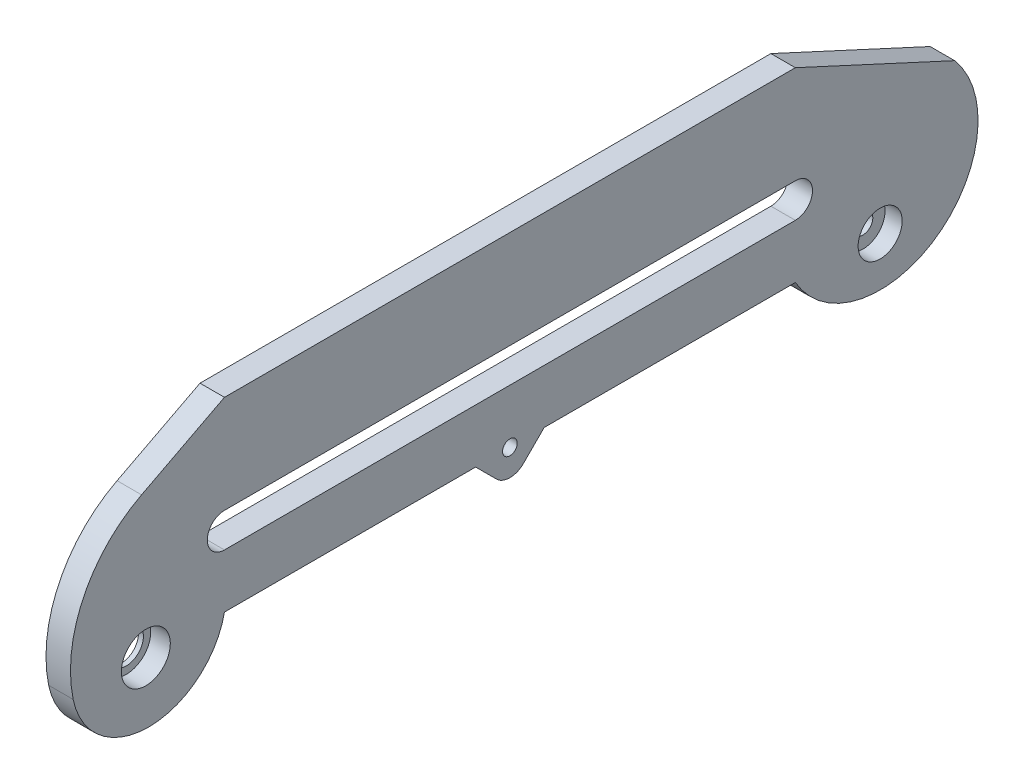
ISO-10303-21;
HEADER;
FILE_DESCRIPTION(('STEP AP214'),'2;1');
FILE_NAME('part.step','',(''),(''),'','','');
FILE_SCHEMA(('AUTOMOTIVE_DESIGN { 1 0 10303 214 1 1 1 1 }'));
ENDSEC;
DATA;
#1=APPLICATION_CONTEXT('core data for automotive mechanical design processes');
#2=APPLICATION_PROTOCOL_DEFINITION('international standard','automotive_design',2000,#1);
#3=PRODUCT_CONTEXT('',#1,'mechanical');
#4=PRODUCT('Part','Part','',(#3));
#5=PRODUCT_RELATED_PRODUCT_CATEGORY('part','',(#4));
#6=PRODUCT_DEFINITION_FORMATION('','',#4);
#7=PRODUCT_DEFINITION_CONTEXT('part definition',#1,'design');
#8=PRODUCT_DEFINITION('design','',#6,#7);
#9=PRODUCT_DEFINITION_SHAPE('','',#8);
#10=(LENGTH_UNIT() NAMED_UNIT(*) SI_UNIT(.MILLI.,.METRE.));
#11=(NAMED_UNIT(*) PLANE_ANGLE_UNIT() SI_UNIT($,.RADIAN.));
#12=(NAMED_UNIT(*) SI_UNIT($,.STERADIAN.) SOLID_ANGLE_UNIT());
#13=UNCERTAINTY_MEASURE_WITH_UNIT(LENGTH_MEASURE(1.E-05),#10,'distance_accuracy_value','');
#14=(GEOMETRIC_REPRESENTATION_CONTEXT(3) GLOBAL_UNCERTAINTY_ASSIGNED_CONTEXT((#13)) GLOBAL_UNIT_ASSIGNED_CONTEXT((#10,
#11,#12)) REPRESENTATION_CONTEXT('',''));
#15=CARTESIAN_POINT('',(0.,0.,0.));
#16=DIRECTION('',(0.,0.,1.));
#17=DIRECTION('',(1.,0.,0.));
#18=AXIS2_PLACEMENT_3D('',#15,#16,#17);
#19=CARTESIAN_POINT('',(5.,-37.996128985248,-75.6291845871765));
#20=DIRECTION('',(-1.,0.,0.));
#21=DIRECTION('',(0.,0.,1.));
#22=AXIS2_PLACEMENT_3D('',#19,#20,#21);
#23=CYLINDRICAL_SURFACE('',#22,1.99999999999998);
#24=CARTESIAN_POINT('',(0.,-37.996128985248,-75.6291845871765));
#25=DIRECTION('',(1.,0.,0.));
#26=DIRECTION('',(0.,0.,-1.));
#27=AXIS2_PLACEMENT_3D('',#24,#25,#26);
#28=CIRCLE('',#27,1.99999999999998);
#29=CARTESIAN_POINT('',(0.,-37.996128985248,-77.6291845871765));
#30=VERTEX_POINT('',#29);
#31=EDGE_CURVE('E176',#30,#30,#28,.T.);
#32=ORIENTED_EDGE('',*,*,#31,.F.);
#33=EDGE_LOOP('',(#32));
#34=FACE_BOUND('',#33,.T.);
#35=CARTESIAN_POINT('',(1.5,-37.996128985248,-75.6291845871765));
#36=DIRECTION('',(1.,0.,0.));
#37=DIRECTION('',(0.,0.,-1.));
#38=AXIS2_PLACEMENT_3D('',#35,#36,#37);
#39=CIRCLE('',#38,1.99999999999998);
#40=CARTESIAN_POINT('',(1.5,-37.996128985248,-77.6291845871765));
#41=VERTEX_POINT('',#40);
#42=EDGE_CURVE('E262',#41,#41,#39,.T.);
#43=ORIENTED_EDGE('',*,*,#42,.T.);
#44=EDGE_LOOP('',(#43));
#45=FACE_BOUND('',#44,.T.);
#46=ADVANCED_FACE('F39',(#34,#45),#23,.F.);
#47=CARTESIAN_POINT('',(5.,-39.4814103594866,0.));
#48=DIRECTION('',(1.,0.,0.));
#49=DIRECTION('',(0.,0.,-1.));
#50=AXIS2_PLACEMENT_3D('',#47,#48,#49);
#51=PLANE('',#50);
#52=CARTESIAN_POINT('',(5.,-37.996128985248,-75.6291845871765));
#53=DIRECTION('',(1.,0.,0.));
#54=DIRECTION('',(0.,0.,-1.));
#55=AXIS2_PLACEMENT_3D('',#52,#53,#54);
#56=CIRCLE('',#55,4.50000000000001);
#57=CARTESIAN_POINT('',(5.,-37.996128985248,-80.1291845871765));
#58=VERTEX_POINT('',#57);
#59=EDGE_CURVE('E272',#58,#58,#56,.T.);
#60=ORIENTED_EDGE('',*,*,#59,.F.);
#61=EDGE_LOOP('',(#60));
#62=FACE_BOUND('',#61,.T.);
#63=CARTESIAN_POINT('',(5.,-37.996128985248,74.3708154128235));
#64=DIRECTION('',(1.,0.,0.));
#65=DIRECTION('',(0.,0.,-1.));
#66=AXIS2_PLACEMENT_3D('',#63,#64,#65);
#67=CIRCLE('',#66,5.00000000000001);
#68=CARTESIAN_POINT('',(5.,-37.996128985248,69.3708154128235));
#69=VERTEX_POINT('',#68);
#70=EDGE_CURVE('E284',#69,#69,#67,.T.);
#71=ORIENTED_EDGE('',*,*,#70,.F.);
#72=EDGE_LOOP('',(#71));
#73=FACE_BOUND('',#72,.T.);
#74=DIRECTION('',(0.,0.,1.));
#75=VECTOR('',#74,1.);
#76=CARTESIAN_POINT('',(5.,-20.,-58.3086765114883));
#77=LINE('',#76,#75);
#78=CARTESIAN_POINT('',(5.,-20.,-58.3086765114883));
#79=VERTEX_POINT('',#78);
#80=CARTESIAN_POINT('',(5.,-20.,58.3086765114883));
#81=VERTEX_POINT('',#80);
#82=EDGE_CURVE('E154',#79,#81,#77,.T.);
#83=ORIENTED_EDGE('',*,*,#82,.F.);
#84=CARTESIAN_POINT('',(5.,-23.5,-58.3086765114883));
#85=DIRECTION('',(1.,0.,0.));
#86=DIRECTION('',(0.,0.,-1.));
#87=AXIS2_PLACEMENT_3D('',#84,#85,#86);
#88=CIRCLE('',#87,3.5);
#89=CARTESIAN_POINT('',(5.,-27.,-58.3086765114883));
#90=VERTEX_POINT('',#89);
#91=EDGE_CURVE('E146',#90,#79,#88,.T.);
#92=ORIENTED_EDGE('',*,*,#91,.F.);
#93=DIRECTION('',(0.,0.,-1.));
#94=VECTOR('',#93,1.);
#95=CARTESIAN_POINT('',(5.,-27.,58.3086765114883));
#96=LINE('',#95,#94);
#97=CARTESIAN_POINT('',(5.,-27.,58.3086765114883));
#98=VERTEX_POINT('',#97);
#99=EDGE_CURVE('E170',#98,#90,#96,.T.);
#100=ORIENTED_EDGE('',*,*,#99,.F.);
#101=CARTESIAN_POINT('',(5.,-23.5,58.3086765114883));
#102=DIRECTION('',(1.,0.,0.));
#103=DIRECTION('',(0.,0.,-1.));
#104=AXIS2_PLACEMENT_3D('',#101,#102,#103);
#105=CIRCLE('',#104,3.5);
#106=EDGE_CURVE('E168',#81,#98,#105,.T.);
#107=ORIENTED_EDGE('',*,*,#106,.F.);
#108=EDGE_LOOP('',(#83,#92,#100,#107));
#109=FACE_BOUND('',#108,.T.);
#110=DIRECTION('',(0.,-0.707106781186547,-0.707106781186548));
#111=VECTOR('',#110,1.);
#112=CARTESIAN_POINT('',(5.,-37.996128985248,7.));
#113=LINE('',#112,#111);
#114=CARTESIAN_POINT('',(5.,-37.996128985248,7.));
#115=VERTEX_POINT('',#114);
#116=CARTESIAN_POINT('',(5.,-42.2387696723673,2.7573593128807));
#117=VERTEX_POINT('',#116);
#118=EDGE_CURVE('E186',#115,#117,#113,.T.);
#119=ORIENTED_EDGE('',*,*,#118,.T.);
#120=CARTESIAN_POINT('',(5.,-39.4814103594866,0.));
#121=DIRECTION('',(1.,0.,0.));
#122=DIRECTION('',(0.,0.,-1.));
#123=AXIS2_PLACEMENT_3D('',#120,#121,#122);
#124=CIRCLE('',#123,3.89949493661165);
#125=CARTESIAN_POINT('',(5.,-42.2387696723673,-2.75735931288071));
#126=VERTEX_POINT('',#125);
#127=EDGE_CURVE('E189',#117,#126,#124,.T.);
#128=ORIENTED_EDGE('',*,*,#127,.T.);
#129=DIRECTION('',(0.,0.707106781186547,-0.707106781186548));
#130=VECTOR('',#129,1.);
#131=CARTESIAN_POINT('',(5.,-42.2387696723673,-2.75735931288071));
#132=LINE('',#131,#130);
#133=CARTESIAN_POINT('',(5.,-37.996128985248,-7.));
#134=VERTEX_POINT('',#133);
#135=EDGE_CURVE('E192',#126,#134,#132,.T.);
#136=ORIENTED_EDGE('',*,*,#135,.T.);
#137=DIRECTION('',(0.,0.,-1.));
#138=VECTOR('',#137,1.);
#139=CARTESIAN_POINT('',(5.,-37.996128985248,-7.));
#140=LINE('',#139,#138);
#141=CARTESIAN_POINT('',(5.,-37.996128985248,-58.3086765114877));
#142=VERTEX_POINT('',#141);
#143=EDGE_CURVE('E194',#134,#142,#140,.T.);
#144=ORIENTED_EDGE('',*,*,#143,.T.);
#145=CARTESIAN_POINT('',(5.,-27.9961289852479,-75.6291845871765));
#146=DIRECTION('',(1.,0.,0.));
#147=DIRECTION('',(0.,0.,-1.));
#148=AXIS2_PLACEMENT_3D('',#145,#146,#147);
#149=CIRCLE('',#148,20.0000000000001);
#150=CARTESIAN_POINT('',(5.,-15.0234869323527,-90.8512264399457));
#151=VERTEX_POINT('',#150);
#152=EDGE_CURVE('E196',#142,#151,#149,.T.);
#153=ORIENTED_EDGE('',*,*,#152,.T.);
#154=DIRECTION('',(0.,0.41914669112093,0.907918526808643));
#155=VECTOR('',#154,1.);
#156=CARTESIAN_POINT('',(5.,-15.0234869323527,-90.8512264399457));
#157=LINE('',#156,#155);
#158=CARTESIAN_POINT('',(5.,0.,-58.3086765114883));
#159=VERTEX_POINT('',#158);
#160=EDGE_CURVE('E198',#151,#159,#157,.T.);
#161=ORIENTED_EDGE('',*,*,#160,.T.);
#162=DIRECTION('',(0.,0.,1.));
#163=VECTOR('',#162,1.);
#164=CARTESIAN_POINT('',(5.,0.,-58.3086765114883));
#165=LINE('',#164,#163);
#166=CARTESIAN_POINT('',(5.,0.,58.3086765114883));
#167=VERTEX_POINT('',#166);
#168=EDGE_CURVE('E200',#159,#167,#165,.T.);
#169=ORIENTED_EDGE('',*,*,#168,.T.);
#170=DIRECTION('',(0.,-0.460402833421338,0.887710105258245));
#171=VECTOR('',#170,1.);
#172=CARTESIAN_POINT('',(5.,0.,58.3086765114883));
#173=LINE('',#172,#171);
#174=CARTESIAN_POINT('',(5.,-8.78317906164381,75.2436652720342));
#175=VERTEX_POINT('',#174);
#176=EDGE_CURVE('E202',#167,#175,#173,.T.);
#177=ORIENTED_EDGE('',*,*,#176,.T.);
#178=CARTESIAN_POINT('',(5.,-32.6056842846763,62.9636397673244));
#179=DIRECTION('',(1.,0.,0.));
#180=DIRECTION('',(0.,0.,-1.));
#181=AXIS2_PLACEMENT_3D('',#178,#179,#180);
#182=CIRCLE('',#181,26.8013205177979);
#183=CARTESIAN_POINT('',(5.,-37.996128985248,89.217284989042));
#184=VERTEX_POINT('',#183);
#185=EDGE_CURVE('E204',#175,#184,#182,.T.);
#186=ORIENTED_EDGE('',*,*,#185,.T.);
#187=CARTESIAN_POINT('',(5.,-34.8230240056765,73.7629807502651));
#188=DIRECTION('',(1.,0.,0.));
#189=DIRECTION('',(0.,0.,-1.));
#190=AXIS2_PLACEMENT_3D('',#187,#188,#189);
#191=CIRCLE('',#190,15.7766953040254);
#192=CARTESIAN_POINT('',(5.,-37.9961289852481,58.3086765114883));
#193=VERTEX_POINT('',#192);
#194=EDGE_CURVE('E206',#184,#193,#191,.T.);
#195=ORIENTED_EDGE('',*,*,#194,.T.);
#196=DIRECTION('',(0.,0.,-1.));
#197=VECTOR('',#196,1.);
#198=CARTESIAN_POINT('',(5.,-37.9961289852481,58.3086765114883));
#199=LINE('',#198,#197);
#200=EDGE_CURVE('E208',#193,#115,#199,.T.);
#201=ORIENTED_EDGE('',*,*,#200,.T.);
#202=EDGE_LOOP('',(#119,#128,#136,#144,#153,#161,#169,#177,#186,#195,#201));
#203=FACE_BOUND('',#202,.T.);
#204=CARTESIAN_POINT('',(5.,-38.,0.));
#205=DIRECTION('',(1.,0.,0.));
#206=DIRECTION('',(0.,0.,-1.));
#207=AXIS2_PLACEMENT_3D('',#204,#205,#206);
#208=CIRCLE('',#207,1.5);
#209=CARTESIAN_POINT('',(5.,-38.,-1.5));
#210=VERTEX_POINT('',#209);
#211=EDGE_CURVE('E269',#210,#210,#208,.T.);
#212=ORIENTED_EDGE('',*,*,#211,.F.);
#213=EDGE_LOOP('',(#212));
#214=FACE_BOUND('',#213,.T.);
#215=ADVANCED_FACE('F166',(#62,#73,#109,#203,#214),#51,.T.);
#216=CARTESIAN_POINT('',(0.,-39.4814103594866,0.));
#217=DIRECTION('',(1.,0.,0.));
#218=DIRECTION('',(0.,0.,-1.));
#219=AXIS2_PLACEMENT_3D('',#216,#217,#218);
#220=PLANE('',#219);
#221=DIRECTION('',(0.,-0.707106781186547,-0.707106781186548));
#222=VECTOR('',#221,1.);
#223=CARTESIAN_POINT('',(0.,-37.996128985248,7.));
#224=LINE('',#223,#222);
#225=CARTESIAN_POINT('',(0.,-37.996128985248,7.));
#226=VERTEX_POINT('',#225);
#227=CARTESIAN_POINT('',(0.,-42.2387696723673,2.7573593128807));
#228=VERTEX_POINT('',#227);
#229=EDGE_CURVE('E162',#226,#228,#224,.T.);
#230=ORIENTED_EDGE('',*,*,#229,.F.);
#231=DIRECTION('',(0.,0.,-1.));
#232=VECTOR('',#231,1.);
#233=CARTESIAN_POINT('',(0.,-37.9961289852481,58.3086765114883));
#234=LINE('',#233,#232);
#235=CARTESIAN_POINT('',(0.,-37.9961289852481,58.3086765114883));
#236=VERTEX_POINT('',#235);
#237=EDGE_CURVE('E190',#236,#226,#234,.T.);
#238=ORIENTED_EDGE('',*,*,#237,.F.);
#239=CARTESIAN_POINT('',(0.,-34.8230240056765,73.7629807502651));
#240=DIRECTION('',(1.,0.,0.));
#241=DIRECTION('',(0.,0.,-1.));
#242=AXIS2_PLACEMENT_3D('',#239,#240,#241);
#243=CIRCLE('',#242,15.7766953040254);
#244=CARTESIAN_POINT('',(0.,-37.996128985248,89.217284989042));
#245=VERTEX_POINT('',#244);
#246=EDGE_CURVE('E229',#245,#236,#243,.T.);
#247=ORIENTED_EDGE('',*,*,#246,.F.);
#248=CARTESIAN_POINT('',(0.,-32.6056842846763,62.9636397673244));
#249=DIRECTION('',(1.,0.,0.));
#250=DIRECTION('',(0.,0.,-1.));
#251=AXIS2_PLACEMENT_3D('',#248,#249,#250);
#252=CIRCLE('',#251,26.8013205177979);
#253=CARTESIAN_POINT('',(0.,-8.78317906164381,75.2436652720342));
#254=VERTEX_POINT('',#253);
#255=EDGE_CURVE('E227',#254,#245,#252,.T.);
#256=ORIENTED_EDGE('',*,*,#255,.F.);
#257=DIRECTION('',(0.,-0.460402833421338,0.887710105258245));
#258=VECTOR('',#257,1.);
#259=CARTESIAN_POINT('',(0.,0.,58.3086765114883));
#260=LINE('',#259,#258);
#261=CARTESIAN_POINT('',(0.,0.,58.3086765114883));
#262=VERTEX_POINT('',#261);
#263=EDGE_CURVE('E225',#262,#254,#260,.T.);
#264=ORIENTED_EDGE('',*,*,#263,.F.);
#265=DIRECTION('',(0.,0.,1.));
#266=VECTOR('',#265,1.);
#267=CARTESIAN_POINT('',(0.,0.,-58.3086765114883));
#268=LINE('',#267,#266);
#269=CARTESIAN_POINT('',(0.,0.,-58.3086765114883));
#270=VERTEX_POINT('',#269);
#271=EDGE_CURVE('E223',#270,#262,#268,.T.);
#272=ORIENTED_EDGE('',*,*,#271,.F.);
#273=DIRECTION('',(0.,0.41914669112093,0.907918526808643));
#274=VECTOR('',#273,1.);
#275=CARTESIAN_POINT('',(0.,-15.0234869323527,-90.8512264399457));
#276=LINE('',#275,#274);
#277=CARTESIAN_POINT('',(0.,-15.0234869323527,-90.8512264399457));
#278=VERTEX_POINT('',#277);
#279=EDGE_CURVE('E221',#278,#270,#276,.T.);
#280=ORIENTED_EDGE('',*,*,#279,.F.);
#281=CARTESIAN_POINT('',(0.,-27.9961289852479,-75.6291845871765));
#282=DIRECTION('',(1.,0.,0.));
#283=DIRECTION('',(0.,0.,-1.));
#284=AXIS2_PLACEMENT_3D('',#281,#282,#283);
#285=CIRCLE('',#284,20.0000000000001);
#286=CARTESIAN_POINT('',(0.,-37.996128985248,-58.3086765114877));
#287=VERTEX_POINT('',#286);
#288=EDGE_CURVE('E219',#287,#278,#285,.T.);
#289=ORIENTED_EDGE('',*,*,#288,.F.);
#290=DIRECTION('',(0.,0.,-1.));
#291=VECTOR('',#290,1.);
#292=CARTESIAN_POINT('',(0.,-37.996128985248,-7.));
#293=LINE('',#292,#291);
#294=CARTESIAN_POINT('',(0.,-37.996128985248,-7.));
#295=VERTEX_POINT('',#294);
#296=EDGE_CURVE('E217',#295,#287,#293,.T.);
#297=ORIENTED_EDGE('',*,*,#296,.F.);
#298=DIRECTION('',(0.,0.707106781186547,-0.707106781186548));
#299=VECTOR('',#298,1.);
#300=CARTESIAN_POINT('',(0.,-42.2387696723673,-2.75735931288071));
#301=LINE('',#300,#299);
#302=CARTESIAN_POINT('',(0.,-42.2387696723673,-2.75735931288071));
#303=VERTEX_POINT('',#302);
#304=EDGE_CURVE('E215',#303,#295,#301,.T.);
#305=ORIENTED_EDGE('',*,*,#304,.F.);
#306=CARTESIAN_POINT('',(0.,-39.4814103594866,0.));
#307=DIRECTION('',(1.,0.,0.));
#308=DIRECTION('',(0.,0.,-1.));
#309=AXIS2_PLACEMENT_3D('',#306,#307,#308);
#310=CIRCLE('',#309,3.89949493661165);
#311=EDGE_CURVE('E213',#228,#303,#310,.T.);
#312=ORIENTED_EDGE('',*,*,#311,.F.);
#313=EDGE_LOOP('',(#230,#238,#247,#256,#264,#272,#280,#289,#297,#305,#312));
#314=FACE_BOUND('',#313,.T.);
#315=CARTESIAN_POINT('',(0.,-23.5,-58.3086765114883));
#316=DIRECTION('',(1.,0.,0.));
#317=DIRECTION('',(0.,0.,-1.));
#318=AXIS2_PLACEMENT_3D('',#315,#316,#317);
#319=CIRCLE('',#318,3.5);
#320=CARTESIAN_POINT('',(0.,-27.,-58.3086765114883));
#321=VERTEX_POINT('',#320);
#322=CARTESIAN_POINT('',(0.,-20.,-58.3086765114883));
#323=VERTEX_POINT('',#322);
#324=EDGE_CURVE('E62',#321,#323,#319,.T.);
#325=ORIENTED_EDGE('',*,*,#324,.T.);
#326=DIRECTION('',(0.,0.,1.));
#327=VECTOR('',#326,1.);
#328=CARTESIAN_POINT('',(0.,-20.,-58.3086765114883));
#329=LINE('',#328,#327);
#330=CARTESIAN_POINT('',(0.,-20.,58.3086765114883));
#331=VERTEX_POINT('',#330);
#332=EDGE_CURVE('E161',#323,#331,#329,.T.);
#333=ORIENTED_EDGE('',*,*,#332,.T.);
#334=CARTESIAN_POINT('',(0.,-23.5,58.3086765114883));
#335=DIRECTION('',(1.,0.,0.));
#336=DIRECTION('',(0.,0.,-1.));
#337=AXIS2_PLACEMENT_3D('',#334,#335,#336);
#338=CIRCLE('',#337,3.5);
#339=CARTESIAN_POINT('',(0.,-27.,58.3086765114883));
#340=VERTEX_POINT('',#339);
#341=EDGE_CURVE('E178',#331,#340,#338,.T.);
#342=ORIENTED_EDGE('',*,*,#341,.T.);
#343=DIRECTION('',(0.,0.,-1.));
#344=VECTOR('',#343,1.);
#345=CARTESIAN_POINT('',(0.,-27.,58.3086765114883));
#346=LINE('',#345,#344);
#347=EDGE_CURVE('E155',#340,#321,#346,.T.);
#348=ORIENTED_EDGE('',*,*,#347,.T.);
#349=EDGE_LOOP('',(#325,#333,#342,#348));
#350=FACE_BOUND('',#349,.T.);
#351=ORIENTED_EDGE('',*,*,#31,.T.);
#352=EDGE_LOOP('',(#351));
#353=FACE_BOUND('',#352,.T.);
#354=CARTESIAN_POINT('',(0.,-38.,0.));
#355=DIRECTION('',(1.,0.,0.));
#356=DIRECTION('',(0.,0.,-1.));
#357=AXIS2_PLACEMENT_3D('',#354,#355,#356);
#358=CIRCLE('',#357,1.5);
#359=CARTESIAN_POINT('',(0.,-38.,-1.5));
#360=VERTEX_POINT('',#359);
#361=EDGE_CURVE('E264',#360,#360,#358,.T.);
#362=ORIENTED_EDGE('',*,*,#361,.T.);
#363=EDGE_LOOP('',(#362));
#364=FACE_BOUND('',#363,.T.);
#365=CARTESIAN_POINT('',(0.,-37.996128985248,74.3708154128235));
#366=DIRECTION('',(1.,0.,0.));
#367=DIRECTION('',(0.,0.,-1.));
#368=AXIS2_PLACEMENT_3D('',#365,#366,#367);
#369=CIRCLE('',#368,3.50000000000001);
#370=CARTESIAN_POINT('',(0.,-37.996128985248,70.8708154128235));
#371=VERTEX_POINT('',#370);
#372=EDGE_CURVE('E280',#371,#371,#369,.T.);
#373=ORIENTED_EDGE('',*,*,#372,.T.);
#374=EDGE_LOOP('',(#373));
#375=FACE_BOUND('',#374,.T.);
#376=ADVANCED_FACE('F290',(#314,#350,#353,#364,#375),#220,.F.);
#377=CARTESIAN_POINT('',(5.,-37.996128985248,7.));
#378=DIRECTION('',(0.,0.707106781186548,-0.707106781186547));
#379=DIRECTION('',(0.,0.707106781186547,0.707106781186548));
#380=AXIS2_PLACEMENT_3D('',#377,#378,#379);
#381=PLANE('',#380);
#382=ORIENTED_EDGE('',*,*,#229,.T.);
#383=DIRECTION('',(-1.,0.,0.));
#384=VECTOR('',#383,1.);
#385=CARTESIAN_POINT('',(5.,-42.2387696723673,2.7573593128807));
#386=LINE('',#385,#384);
#387=EDGE_CURVE('E47',#117,#228,#386,.T.);
#388=ORIENTED_EDGE('',*,*,#387,.F.);
#389=ORIENTED_EDGE('',*,*,#118,.F.);
#390=DIRECTION('',(-1.,0.,0.));
#391=VECTOR('',#390,1.);
#392=CARTESIAN_POINT('',(5.,-37.996128985248,7.));
#393=LINE('',#392,#391);
#394=EDGE_CURVE('E210',#115,#226,#393,.T.);
#395=ORIENTED_EDGE('',*,*,#394,.T.);
#396=EDGE_LOOP('',(#382,#388,#389,#395));
#397=FACE_BOUND('',#396,.T.);
#398=ADVANCED_FACE('F41',(#397),#381,.F.);
#399=CARTESIAN_POINT('',(5.,-39.4814103594866,0.));
#400=DIRECTION('',(-1.,0.,0.));
#401=DIRECTION('',(0.,0.,1.));
#402=AXIS2_PLACEMENT_3D('',#399,#400,#401);
#403=CYLINDRICAL_SURFACE('',#402,3.89949493661165);
#404=ORIENTED_EDGE('',*,*,#311,.T.);
#405=DIRECTION('',(-1.,0.,0.));
#406=VECTOR('',#405,1.);
#407=CARTESIAN_POINT('',(5.,-42.2387696723673,-2.75735931288071));
#408=LINE('',#407,#406);
#409=EDGE_CURVE('E258',#126,#303,#408,.T.);
#410=ORIENTED_EDGE('',*,*,#409,.F.);
#411=ORIENTED_EDGE('',*,*,#127,.F.);
#412=ORIENTED_EDGE('',*,*,#387,.T.);
#413=EDGE_LOOP('',(#404,#410,#411,#412));
#414=FACE_BOUND('',#413,.T.);
#415=ADVANCED_FACE('F353',(#414),#403,.T.);
#416=CARTESIAN_POINT('',(5.,-42.2387696723673,-2.75735931288071));
#417=DIRECTION('',(0.,0.707106781186548,0.707106781186547));
#418=DIRECTION('',(0.,-0.707106781186547,0.707106781186548));
#419=AXIS2_PLACEMENT_3D('',#416,#417,#418);
#420=PLANE('',#419);
#421=ORIENTED_EDGE('',*,*,#304,.T.);
#422=DIRECTION('',(-1.,0.,0.));
#423=VECTOR('',#422,1.);
#424=CARTESIAN_POINT('',(5.,-37.996128985248,-7.));
#425=LINE('',#424,#423);
#426=EDGE_CURVE('E255',#134,#295,#425,.T.);
#427=ORIENTED_EDGE('',*,*,#426,.F.);
#428=ORIENTED_EDGE('',*,*,#135,.F.);
#429=ORIENTED_EDGE('',*,*,#409,.T.);
#430=EDGE_LOOP('',(#421,#427,#428,#429));
#431=FACE_BOUND('',#430,.T.);
#432=ADVANCED_FACE('F350',(#431),#420,.F.);
#433=CARTESIAN_POINT('',(5.,-37.996128985248,-7.));
#434=DIRECTION('',(0.,1.,0.));
#435=DIRECTION('',(0.,0.,1.));
#436=AXIS2_PLACEMENT_3D('',#433,#434,#435);
#437=PLANE('',#436);
#438=ORIENTED_EDGE('',*,*,#296,.T.);
#439=DIRECTION('',(-1.,0.,0.));
#440=VECTOR('',#439,1.);
#441=CARTESIAN_POINT('',(5.,-37.996128985248,-58.3086765114877));
#442=LINE('',#441,#440);
#443=EDGE_CURVE('E252',#142,#287,#442,.T.);
#444=ORIENTED_EDGE('',*,*,#443,.F.);
#445=ORIENTED_EDGE('',*,*,#143,.F.);
#446=ORIENTED_EDGE('',*,*,#426,.T.);
#447=EDGE_LOOP('',(#438,#444,#445,#446));
#448=FACE_BOUND('',#447,.T.);
#449=ADVANCED_FACE('F346',(#448),#437,.F.);
#450=CARTESIAN_POINT('',(5.,-27.9961289852479,-75.6291845871765));
#451=DIRECTION('',(-1.,0.,0.));
#452=DIRECTION('',(0.,0.,1.));
#453=AXIS2_PLACEMENT_3D('',#450,#451,#452);
#454=CYLINDRICAL_SURFACE('',#453,20.0000000000001);
#455=ORIENTED_EDGE('',*,*,#288,.T.);
#456=DIRECTION('',(-1.,0.,0.));
#457=VECTOR('',#456,1.);
#458=CARTESIAN_POINT('',(5.,-15.0234869323527,-90.8512264399457));
#459=LINE('',#458,#457);
#460=EDGE_CURVE('E249',#151,#278,#459,.T.);
#461=ORIENTED_EDGE('',*,*,#460,.F.);
#462=ORIENTED_EDGE('',*,*,#152,.F.);
#463=ORIENTED_EDGE('',*,*,#443,.T.);
#464=EDGE_LOOP('',(#455,#461,#462,#463));
#465=FACE_BOUND('',#464,.T.);
#466=ADVANCED_FACE('F342',(#465),#454,.T.);
#467=CARTESIAN_POINT('',(5.,-15.0234869323527,-90.8512264399457));
#468=DIRECTION('',(0.,-0.907918526808643,0.41914669112093));
#469=DIRECTION('',(0.,-0.41914669112093,-0.907918526808643));
#470=AXIS2_PLACEMENT_3D('',#467,#468,#469);
#471=PLANE('',#470);
#472=ORIENTED_EDGE('',*,*,#279,.T.);
#473=DIRECTION('',(-1.,0.,0.));
#474=VECTOR('',#473,1.);
#475=CARTESIAN_POINT('',(5.,0.,-58.3086765114883));
#476=LINE('',#475,#474);
#477=EDGE_CURVE('E246',#159,#270,#476,.T.);
#478=ORIENTED_EDGE('',*,*,#477,.F.);
#479=ORIENTED_EDGE('',*,*,#160,.F.);
#480=ORIENTED_EDGE('',*,*,#460,.T.);
#481=EDGE_LOOP('',(#472,#478,#479,#480));
#482=FACE_BOUND('',#481,.T.);
#483=ADVANCED_FACE('F338',(#482),#471,.F.);
#484=CARTESIAN_POINT('',(5.,0.,-58.3086765114883));
#485=DIRECTION('',(0.,-1.,0.));
#486=DIRECTION('',(0.,0.,-1.));
#487=AXIS2_PLACEMENT_3D('',#484,#485,#486);
#488=PLANE('',#487);
#489=ORIENTED_EDGE('',*,*,#271,.T.);
#490=DIRECTION('',(-1.,0.,0.));
#491=VECTOR('',#490,1.);
#492=CARTESIAN_POINT('',(5.,0.,58.3086765114883));
#493=LINE('',#492,#491);
#494=EDGE_CURVE('E243',#167,#262,#493,.T.);
#495=ORIENTED_EDGE('',*,*,#494,.F.);
#496=ORIENTED_EDGE('',*,*,#168,.F.);
#497=ORIENTED_EDGE('',*,*,#477,.T.);
#498=EDGE_LOOP('',(#489,#495,#496,#497));
#499=FACE_BOUND('',#498,.T.);
#500=ADVANCED_FACE('F334',(#499),#488,.F.);
#501=CARTESIAN_POINT('',(5.,0.,58.3086765114883));
#502=DIRECTION('',(0.,-0.887710105258245,-0.460402833421338));
#503=DIRECTION('',(0.,0.460402833421338,-0.887710105258245));
#504=AXIS2_PLACEMENT_3D('',#501,#502,#503);
#505=PLANE('',#504);
#506=ORIENTED_EDGE('',*,*,#263,.T.);
#507=DIRECTION('',(-1.,0.,0.));
#508=VECTOR('',#507,1.);
#509=CARTESIAN_POINT('',(5.,-8.78317906164381,75.2436652720342));
#510=LINE('',#509,#508);
#511=EDGE_CURVE('E240',#175,#254,#510,.T.);
#512=ORIENTED_EDGE('',*,*,#511,.F.);
#513=ORIENTED_EDGE('',*,*,#176,.F.);
#514=ORIENTED_EDGE('',*,*,#494,.T.);
#515=EDGE_LOOP('',(#506,#512,#513,#514));
#516=FACE_BOUND('',#515,.T.);
#517=ADVANCED_FACE('F330',(#516),#505,.F.);
#518=CARTESIAN_POINT('',(5.,-32.6056842846763,62.9636397673244));
#519=DIRECTION('',(-1.,0.,0.));
#520=DIRECTION('',(0.,0.,1.));
#521=AXIS2_PLACEMENT_3D('',#518,#519,#520);
#522=CYLINDRICAL_SURFACE('',#521,26.8013205177979);
#523=ORIENTED_EDGE('',*,*,#255,.T.);
#524=DIRECTION('',(-1.,0.,0.));
#525=VECTOR('',#524,1.);
#526=CARTESIAN_POINT('',(5.,-37.996128985248,89.217284989042));
#527=LINE('',#526,#525);
#528=EDGE_CURVE('E237',#184,#245,#527,.T.);
#529=ORIENTED_EDGE('',*,*,#528,.F.);
#530=ORIENTED_EDGE('',*,*,#185,.F.);
#531=ORIENTED_EDGE('',*,*,#511,.T.);
#532=EDGE_LOOP('',(#523,#529,#530,#531));
#533=FACE_BOUND('',#532,.T.);
#534=ADVANCED_FACE('F326',(#533),#522,.T.);
#535=CARTESIAN_POINT('',(5.,-34.8230240056765,73.7629807502651));
#536=DIRECTION('',(-1.,0.,0.));
#537=DIRECTION('',(0.,0.,1.));
#538=AXIS2_PLACEMENT_3D('',#535,#536,#537);
#539=CYLINDRICAL_SURFACE('',#538,15.7766953040254);
#540=ORIENTED_EDGE('',*,*,#246,.T.);
#541=DIRECTION('',(-1.,0.,0.));
#542=VECTOR('',#541,1.);
#543=CARTESIAN_POINT('',(5.,-37.9961289852481,58.3086765114883));
#544=LINE('',#543,#542);
#545=EDGE_CURVE('E234',#193,#236,#544,.T.);
#546=ORIENTED_EDGE('',*,*,#545,.F.);
#547=ORIENTED_EDGE('',*,*,#194,.F.);
#548=ORIENTED_EDGE('',*,*,#528,.T.);
#549=EDGE_LOOP('',(#540,#546,#547,#548));
#550=FACE_BOUND('',#549,.T.);
#551=ADVANCED_FACE('F322',(#550),#539,.T.);
#552=CARTESIAN_POINT('',(5.,-37.9961289852481,58.3086765114883));
#553=DIRECTION('',(0.,1.,0.));
#554=DIRECTION('',(0.,0.,1.));
#555=AXIS2_PLACEMENT_3D('',#552,#553,#554);
#556=PLANE('',#555);
#557=ORIENTED_EDGE('',*,*,#237,.T.);
#558=ORIENTED_EDGE('',*,*,#394,.F.);
#559=ORIENTED_EDGE('',*,*,#200,.F.);
#560=ORIENTED_EDGE('',*,*,#545,.T.);
#561=EDGE_LOOP('',(#557,#558,#559,#560));
#562=FACE_BOUND('',#561,.T.);
#563=ADVANCED_FACE('F315',(#562),#556,.F.);
#564=CARTESIAN_POINT('',(5.,-23.5,-58.3086765114883));
#565=DIRECTION('',(-1.,0.,0.));
#566=DIRECTION('',(0.,0.,1.));
#567=AXIS2_PLACEMENT_3D('',#564,#565,#566);
#568=CYLINDRICAL_SURFACE('',#567,3.5);
#569=ORIENTED_EDGE('',*,*,#324,.F.);
#570=DIRECTION('',(-1.,0.,0.));
#571=VECTOR('',#570,1.);
#572=CARTESIAN_POINT('',(5.,-27.,-58.3086765114883));
#573=LINE('',#572,#571);
#574=EDGE_CURVE('E150',#90,#321,#573,.T.);
#575=ORIENTED_EDGE('',*,*,#574,.F.);
#576=ORIENTED_EDGE('',*,*,#91,.T.);
#577=DIRECTION('',(-1.,0.,0.));
#578=VECTOR('',#577,1.);
#579=CARTESIAN_POINT('',(5.,-20.,-58.3086765114883));
#580=LINE('',#579,#578);
#581=EDGE_CURVE('E149',#79,#323,#580,.T.);
#582=ORIENTED_EDGE('',*,*,#581,.T.);
#583=EDGE_LOOP('',(#569,#575,#576,#582));
#584=FACE_BOUND('',#583,.T.);
#585=ADVANCED_FACE('F148',(#584),#568,.F.);
#586=CARTESIAN_POINT('',(5.,-20.,-58.3086765114883));
#587=DIRECTION('',(0.,-1.,0.));
#588=DIRECTION('',(0.,0.,-1.));
#589=AXIS2_PLACEMENT_3D('',#586,#587,#588);
#590=PLANE('',#589);
#591=ORIENTED_EDGE('',*,*,#332,.F.);
#592=ORIENTED_EDGE('',*,*,#581,.F.);
#593=ORIENTED_EDGE('',*,*,#82,.T.);
#594=DIRECTION('',(-1.,0.,0.));
#595=VECTOR('',#594,1.);
#596=CARTESIAN_POINT('',(5.,-20.,58.3086765114883));
#597=LINE('',#596,#595);
#598=EDGE_CURVE('E163',#81,#331,#597,.T.);
#599=ORIENTED_EDGE('',*,*,#598,.T.);
#600=EDGE_LOOP('',(#591,#592,#593,#599));
#601=FACE_BOUND('',#600,.T.);
#602=ADVANCED_FACE('F158',(#601),#590,.T.);
#603=CARTESIAN_POINT('',(5.,-23.5,58.3086765114883));
#604=DIRECTION('',(-1.,0.,0.));
#605=DIRECTION('',(0.,0.,1.));
#606=AXIS2_PLACEMENT_3D('',#603,#604,#605);
#607=CYLINDRICAL_SURFACE('',#606,3.5);
#608=ORIENTED_EDGE('',*,*,#341,.F.);
#609=ORIENTED_EDGE('',*,*,#598,.F.);
#610=ORIENTED_EDGE('',*,*,#106,.T.);
#611=DIRECTION('',(-1.,0.,0.));
#612=VECTOR('',#611,1.);
#613=CARTESIAN_POINT('',(5.,-27.,58.3086765114883));
#614=LINE('',#613,#612);
#615=EDGE_CURVE('E54',#98,#340,#614,.T.);
#616=ORIENTED_EDGE('',*,*,#615,.T.);
#617=EDGE_LOOP('',(#608,#609,#610,#616));
#618=FACE_BOUND('',#617,.T.);
#619=ADVANCED_FACE('F308',(#618),#607,.F.);
#620=CARTESIAN_POINT('',(5.,-27.,58.3086765114883));
#621=DIRECTION('',(0.,1.,0.));
#622=DIRECTION('',(0.,0.,1.));
#623=AXIS2_PLACEMENT_3D('',#620,#621,#622);
#624=PLANE('',#623);
#625=ORIENTED_EDGE('',*,*,#347,.F.);
#626=ORIENTED_EDGE('',*,*,#615,.F.);
#627=ORIENTED_EDGE('',*,*,#99,.T.);
#628=ORIENTED_EDGE('',*,*,#574,.T.);
#629=EDGE_LOOP('',(#625,#626,#627,#628));
#630=FACE_BOUND('',#629,.T.);
#631=ADVANCED_FACE('F305',(#630),#624,.T.);
#632=CARTESIAN_POINT('',(5.,-37.996128985248,74.3708154128235));
#633=DIRECTION('',(-1.,0.,0.));
#634=DIRECTION('',(0.,0.,1.));
#635=AXIS2_PLACEMENT_3D('',#632,#633,#634);
#636=CYLINDRICAL_SURFACE('',#635,5.00000000000001);
#637=CARTESIAN_POINT('',(1.,-37.996128985248,74.3708154128235));
#638=DIRECTION('',(1.,0.,0.));
#639=DIRECTION('',(0.,0.,-1.));
#640=AXIS2_PLACEMENT_3D('',#637,#638,#639);
#641=CIRCLE('',#640,5.00000000000001);
#642=CARTESIAN_POINT('',(1.,-37.996128985248,69.3708154128235));
#643=VERTEX_POINT('',#642);
#644=EDGE_CURVE('E11',#643,#643,#641,.T.);
#645=ORIENTED_EDGE('',*,*,#644,.F.);
#646=EDGE_LOOP('',(#645));
#647=FACE_BOUND('',#646,.T.);
#648=ORIENTED_EDGE('',*,*,#70,.T.);
#649=EDGE_LOOP('',(#648));
#650=FACE_BOUND('',#649,.T.);
#651=ADVANCED_FACE('F303',(#647,#650),#636,.F.);
#652=CARTESIAN_POINT('',(5.,-38.,0.));
#653=DIRECTION('',(-1.,0.,0.));
#654=DIRECTION('',(0.,0.,1.));
#655=AXIS2_PLACEMENT_3D('',#652,#653,#654);
#656=CYLINDRICAL_SURFACE('',#655,1.5);
#657=ORIENTED_EDGE('',*,*,#211,.T.);
#658=EDGE_LOOP('',(#657));
#659=FACE_BOUND('',#658,.T.);
#660=ORIENTED_EDGE('',*,*,#361,.F.);
#661=EDGE_LOOP('',(#660));
#662=FACE_BOUND('',#661,.T.);
#663=ADVANCED_FACE('F396',(#659,#662),#656,.F.);
#664=CARTESIAN_POINT('',(1.5,-37.996128985248,-75.6291845871765));
#665=DIRECTION('',(1.,0.,0.));
#666=DIRECTION('',(0.,0.,-1.));
#667=AXIS2_PLACEMENT_3D('',#664,#665,#666);
#668=CYLINDRICAL_SURFACE('',#667,4.50000000000001);
#669=CARTESIAN_POINT('',(1.5,-37.996128985248,-75.6291845871765));
#670=DIRECTION('',(1.,0.,0.));
#671=DIRECTION('',(0.,0.,-1.));
#672=AXIS2_PLACEMENT_3D('',#669,#670,#671);
#673=CIRCLE('',#672,4.50000000000001);
#674=CARTESIAN_POINT('',(1.5,-37.996128985248,-80.1291845871765));
#675=VERTEX_POINT('',#674);
#676=EDGE_CURVE('E265',#675,#675,#673,.T.);
#677=ORIENTED_EDGE('',*,*,#676,.F.);
#678=EDGE_LOOP('',(#677));
#679=FACE_BOUND('',#678,.T.);
#680=ORIENTED_EDGE('',*,*,#59,.T.);
#681=EDGE_LOOP('',(#680));
#682=FACE_BOUND('',#681,.T.);
#683=ADVANCED_FACE('F398',(#679,#682),#668,.F.);
#684=CARTESIAN_POINT('',(1.5,-37.996128985248,-75.6291845871765));
#685=DIRECTION('',(1.,0.,0.));
#686=DIRECTION('',(0.,0.,-1.));
#687=AXIS2_PLACEMENT_3D('',#684,#685,#686);
#688=PLANE('',#687);
#689=ORIENTED_EDGE('',*,*,#42,.F.);
#690=EDGE_LOOP('',(#689));
#691=FACE_BOUND('',#690,.T.);
#692=ORIENTED_EDGE('',*,*,#676,.T.);
#693=EDGE_LOOP('',(#692));
#694=FACE_BOUND('',#693,.T.);
#695=ADVANCED_FACE('F411',(#691,#694),#688,.T.);
#696=CARTESIAN_POINT('',(1.,-37.996128985248,74.3708154128235));
#697=DIRECTION('',(1.,0.,0.));
#698=DIRECTION('',(0.,0.,-1.));
#699=AXIS2_PLACEMENT_3D('',#696,#697,#698);
#700=PLANE('',#699);
#701=ORIENTED_EDGE('',*,*,#644,.T.);
#702=EDGE_LOOP('',(#701));
#703=FACE_BOUND('',#702,.T.);
#704=CARTESIAN_POINT('',(1.,-37.996128985248,74.3708154128235));
#705=DIRECTION('',(1.,0.,0.));
#706=DIRECTION('',(0.,0.,-1.));
#707=AXIS2_PLACEMENT_3D('',#704,#705,#706);
#708=CIRCLE('',#707,3.50000000000001);
#709=CARTESIAN_POINT('',(1.,-37.996128985248,70.8708154128235));
#710=VERTEX_POINT('',#709);
#711=EDGE_CURVE('E277',#710,#710,#708,.T.);
#712=ORIENTED_EDGE('',*,*,#711,.F.);
#713=EDGE_LOOP('',(#712));
#714=FACE_BOUND('',#713,.T.);
#715=ADVANCED_FACE('F409',(#703,#714),#700,.T.);
#716=CARTESIAN_POINT('',(1.,-37.996128985248,74.3708154128235));
#717=DIRECTION('',(-1.,0.,0.));
#718=DIRECTION('',(0.,0.,1.));
#719=AXIS2_PLACEMENT_3D('',#716,#717,#718);
#720=CYLINDRICAL_SURFACE('',#719,3.50000000000001);
#721=ORIENTED_EDGE('',*,*,#711,.T.);
#722=EDGE_LOOP('',(#721));
#723=FACE_BOUND('',#722,.T.);
#724=ORIENTED_EDGE('',*,*,#372,.F.);
#725=EDGE_LOOP('',(#724));
#726=FACE_BOUND('',#725,.T.);
#727=ADVANCED_FACE('F407',(#723,#726),#720,.F.);
#728=CLOSED_SHELL('',(#46,#215,#376,#398,#415,#432,#449,#466,#483,#500,#517,#534,#551,#563,#585,
#602,#619,#631,#651,#663,#683,#695,#715,#727));
#729=MANIFOLD_SOLID_BREP('B2',#728);
#730=ADVANCED_BREP_SHAPE_REPRESENTATION('',(#18,#729),#14);
#731=SHAPE_DEFINITION_REPRESENTATION(#9,#730);
ENDSEC;
END-ISO-10303-21;
